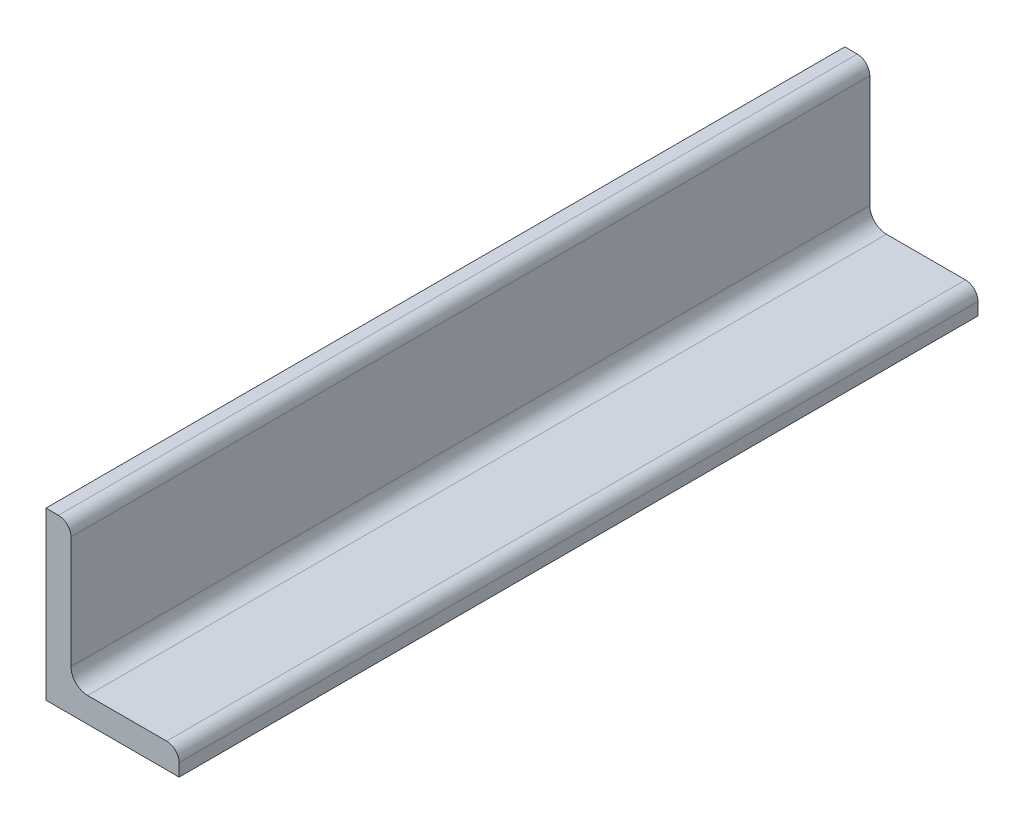
ISO-10303-21;
HEADER;
FILE_DESCRIPTION(('STEP AP214'),'2;1');
FILE_NAME('part.step','',(''),(''),'','','');
FILE_SCHEMA(('AUTOMOTIVE_DESIGN { 1 0 10303 214 1 1 1 1 }'));
ENDSEC;
DATA;
#1=APPLICATION_CONTEXT('core data for automotive mechanical design processes');
#2=APPLICATION_PROTOCOL_DEFINITION('international standard','automotive_design',2000,#1);
#3=PRODUCT_CONTEXT('',#1,'mechanical');
#4=PRODUCT('Part','Part','',(#3));
#5=PRODUCT_RELATED_PRODUCT_CATEGORY('part','',(#4));
#6=PRODUCT_DEFINITION_FORMATION('','',#4);
#7=PRODUCT_DEFINITION_CONTEXT('part definition',#1,'design');
#8=PRODUCT_DEFINITION('design','',#6,#7);
#9=PRODUCT_DEFINITION_SHAPE('','',#8);
#10=(LENGTH_UNIT() NAMED_UNIT(*) SI_UNIT(.MILLI.,.METRE.));
#11=(NAMED_UNIT(*) PLANE_ANGLE_UNIT() SI_UNIT($,.RADIAN.));
#12=(NAMED_UNIT(*) SI_UNIT($,.STERADIAN.) SOLID_ANGLE_UNIT());
#13=UNCERTAINTY_MEASURE_WITH_UNIT(LENGTH_MEASURE(1.E-05),#10,'distance_accuracy_value','');
#14=(GEOMETRIC_REPRESENTATION_CONTEXT(3) GLOBAL_UNCERTAINTY_ASSIGNED_CONTEXT((#13)) GLOBAL_UNIT_ASSIGNED_CONTEXT((#10,
#11,#12)) REPRESENTATION_CONTEXT('',''));
#15=CARTESIAN_POINT('',(0.,0.,0.));
#16=DIRECTION('',(0.,0.,1.));
#17=DIRECTION('',(1.,0.,0.));
#18=AXIS2_PLACEMENT_3D('',#15,#16,#17);
#19=CARTESIAN_POINT('',(0.116507760447575,63.8534276781816,304.8));
#20=DIRECTION('',(1.,0.,0.));
#21=DIRECTION('',(0.,0.,-1.));
#22=AXIS2_PLACEMENT_3D('',#19,#20,#21);
#23=PLANE('',#22);
#24=DIRECTION('',(0.,-1.,0.));
#25=VECTOR('',#24,1.);
#26=CARTESIAN_POINT('',(0.116507760447575,63.8534276781816,0.));
#27=LINE('',#26,#25);
#28=CARTESIAN_POINT('',(0.116507760447575,63.8534276781816,0.));
#29=VERTEX_POINT('',#28);
#30=CARTESIAN_POINT('',(0.116507760447575,0.353427678181561,0.));
#31=VERTEX_POINT('',#30);
#32=EDGE_CURVE('E135',#29,#31,#27,.T.);
#33=ORIENTED_EDGE('',*,*,#32,.T.);
#34=DIRECTION('',(0.,0.,-1.));
#35=VECTOR('',#34,1.);
#36=CARTESIAN_POINT('',(0.116507760447575,0.353427678181561,304.8));
#37=LINE('',#36,#35);
#38=CARTESIAN_POINT('',(0.116507760447575,0.353427678181561,304.8));
#39=VERTEX_POINT('',#38);
#40=EDGE_CURVE('E11',#39,#31,#37,.T.);
#41=ORIENTED_EDGE('',*,*,#40,.F.);
#42=DIRECTION('',(0.,-1.,0.));
#43=VECTOR('',#42,1.);
#44=CARTESIAN_POINT('',(0.116507760447575,63.8534276781816,304.8));
#45=LINE('',#44,#43);
#46=CARTESIAN_POINT('',(0.116507760447575,63.8534276781816,304.8));
#47=VERTEX_POINT('',#46);
#48=EDGE_CURVE('E151',#47,#39,#45,.T.);
#49=ORIENTED_EDGE('',*,*,#48,.F.);
#50=DIRECTION('',(0.,0.,-1.));
#51=VECTOR('',#50,1.);
#52=CARTESIAN_POINT('',(0.116507760447575,63.8534276781816,304.8));
#53=LINE('',#52,#51);
#54=EDGE_CURVE('E131',#47,#29,#53,.T.);
#55=ORIENTED_EDGE('',*,*,#54,.T.);
#56=EDGE_LOOP('',(#33,#41,#49,#55));
#57=FACE_BOUND('',#56,.T.);
#58=ADVANCED_FACE('F33',(#57),#23,.F.);
#59=CARTESIAN_POINT('',(0.116507760447575,0.353427678181561,304.8));
#60=DIRECTION('',(0.,1.,0.));
#61=DIRECTION('',(0.,0.,1.));
#62=AXIS2_PLACEMENT_3D('',#59,#60,#61);
#63=PLANE('',#62);
#64=DIRECTION('',(1.,0.,0.));
#65=VECTOR('',#64,1.);
#66=CARTESIAN_POINT('',(0.116507760447575,0.353427678181561,0.));
#67=LINE('',#66,#65);
#68=CARTESIAN_POINT('',(50.9165077604476,0.353427678181561,0.));
#69=VERTEX_POINT('',#68);
#70=EDGE_CURVE('E138',#31,#69,#67,.T.);
#71=ORIENTED_EDGE('',*,*,#70,.T.);
#72=DIRECTION('',(0.,0.,-1.));
#73=VECTOR('',#72,1.);
#74=CARTESIAN_POINT('',(50.9165077604476,0.353427678181561,304.8));
#75=LINE('',#74,#73);
#76=CARTESIAN_POINT('',(50.9165077604476,0.353427678181561,304.8));
#77=VERTEX_POINT('',#76);
#78=EDGE_CURVE('E41',#77,#69,#75,.T.);
#79=ORIENTED_EDGE('',*,*,#78,.F.);
#80=DIRECTION('',(1.,0.,0.));
#81=VECTOR('',#80,1.);
#82=CARTESIAN_POINT('',(0.116507760447575,0.353427678181561,304.8));
#83=LINE('',#82,#81);
#84=EDGE_CURVE('E95',#39,#77,#83,.T.);
#85=ORIENTED_EDGE('',*,*,#84,.F.);
#86=ORIENTED_EDGE('',*,*,#40,.T.);
#87=EDGE_LOOP('',(#71,#79,#85,#86));
#88=FACE_BOUND('',#87,.T.);
#89=ADVANCED_FACE('F194',(#88),#63,.F.);
#90=CARTESIAN_POINT('',(50.9165077604476,0.353427678181561,304.8));
#91=DIRECTION('',(-1.,0.,0.));
#92=DIRECTION('',(0.,0.,1.));
#93=AXIS2_PLACEMENT_3D('',#90,#91,#92);
#94=PLANE('',#93);
#95=DIRECTION('',(0.,1.,0.));
#96=VECTOR('',#95,1.);
#97=CARTESIAN_POINT('',(50.9165077604476,0.353427678181561,0.));
#98=LINE('',#97,#96);
#99=CARTESIAN_POINT('',(50.9165077604476,5.11592767818156,0.));
#100=VERTEX_POINT('',#99);
#101=EDGE_CURVE('E140',#69,#100,#98,.T.);
#102=ORIENTED_EDGE('',*,*,#101,.T.);
#103=DIRECTION('',(0.,0.,-1.));
#104=VECTOR('',#103,1.);
#105=CARTESIAN_POINT('',(50.9165077604476,5.11592767818156,304.8));
#106=LINE('',#105,#104);
#107=CARTESIAN_POINT('',(50.9165077604476,5.11592767818156,304.8));
#108=VERTEX_POINT('',#107);
#109=EDGE_CURVE('E161',#108,#100,#106,.T.);
#110=ORIENTED_EDGE('',*,*,#109,.F.);
#111=DIRECTION('',(0.,1.,0.));
#112=VECTOR('',#111,1.);
#113=CARTESIAN_POINT('',(50.9165077604476,0.353427678181561,304.8));
#114=LINE('',#113,#112);
#115=EDGE_CURVE('E169',#77,#108,#114,.T.);
#116=ORIENTED_EDGE('',*,*,#115,.F.);
#117=ORIENTED_EDGE('',*,*,#78,.T.);
#118=EDGE_LOOP('',(#102,#110,#116,#117));
#119=FACE_BOUND('',#118,.T.);
#120=ADVANCED_FACE('F167',(#119),#94,.F.);
#121=CARTESIAN_POINT('',(46.1540077604476,5.11592767818156,304.8));
#122=DIRECTION('',(0.,0.,-1.));
#123=DIRECTION('',(-1.,0.,0.));
#124=AXIS2_PLACEMENT_3D('',#121,#122,#123);
#125=CYLINDRICAL_SURFACE('',#124,4.7625);
#126=CARTESIAN_POINT('',(46.1540077604476,5.11592767818156,0.));
#127=DIRECTION('',(0.,0.,1.));
#128=DIRECTION('',(1.,0.,0.));
#129=AXIS2_PLACEMENT_3D('',#126,#127,#128);
#130=CIRCLE('',#129,4.7625);
#131=CARTESIAN_POINT('',(46.1540077604476,9.87842767818156,0.));
#132=VERTEX_POINT('',#131);
#133=EDGE_CURVE('E142',#100,#132,#130,.T.);
#134=ORIENTED_EDGE('',*,*,#133,.T.);
#135=DIRECTION('',(0.,0.,-1.));
#136=VECTOR('',#135,1.);
#137=CARTESIAN_POINT('',(46.1540077604476,9.87842767818156,304.8));
#138=LINE('',#137,#136);
#139=CARTESIAN_POINT('',(46.1540077604476,9.87842767818156,304.8));
#140=VERTEX_POINT('',#139);
#141=EDGE_CURVE('E158',#140,#132,#138,.T.);
#142=ORIENTED_EDGE('',*,*,#141,.F.);
#143=CARTESIAN_POINT('',(46.1540077604476,5.11592767818156,304.8));
#144=DIRECTION('',(0.,0.,1.));
#145=DIRECTION('',(1.,0.,0.));
#146=AXIS2_PLACEMENT_3D('',#143,#144,#145);
#147=CIRCLE('',#146,4.7625);
#148=EDGE_CURVE('E185',#108,#140,#147,.T.);
#149=ORIENTED_EDGE('',*,*,#148,.F.);
#150=ORIENTED_EDGE('',*,*,#109,.T.);
#151=EDGE_LOOP('',(#134,#142,#149,#150));
#152=FACE_BOUND('',#151,.T.);
#153=ADVANCED_FACE('F178',(#152),#125,.T.);
#154=CARTESIAN_POINT('',(46.1540077604476,9.87842767818156,304.8));
#155=DIRECTION('',(0.,-1.,0.));
#156=DIRECTION('',(0.,0.,-1.));
#157=AXIS2_PLACEMENT_3D('',#154,#155,#156);
#158=PLANE('',#157);
#159=DIRECTION('',(-1.,0.,0.));
#160=VECTOR('',#159,1.);
#161=CARTESIAN_POINT('',(46.1540077604476,9.87842767818156,0.));
#162=LINE('',#161,#160);
#163=CARTESIAN_POINT('',(15.9915077604476,9.87842767818156,0.));
#164=VERTEX_POINT('',#163);
#165=EDGE_CURVE('E144',#132,#164,#162,.T.);
#166=ORIENTED_EDGE('',*,*,#165,.T.);
#167=DIRECTION('',(0.,0.,-1.));
#168=VECTOR('',#167,1.);
#169=CARTESIAN_POINT('',(15.9915077604476,9.87842767818156,304.8));
#170=LINE('',#169,#168);
#171=CARTESIAN_POINT('',(15.9915077604476,9.87842767818156,304.8));
#172=VERTEX_POINT('',#171);
#173=EDGE_CURVE('E155',#172,#164,#170,.T.);
#174=ORIENTED_EDGE('',*,*,#173,.F.);
#175=DIRECTION('',(-1.,0.,0.));
#176=VECTOR('',#175,1.);
#177=CARTESIAN_POINT('',(46.1540077604476,9.87842767818156,304.8));
#178=LINE('',#177,#176);
#179=EDGE_CURVE('E184',#140,#172,#178,.T.);
#180=ORIENTED_EDGE('',*,*,#179,.F.);
#181=ORIENTED_EDGE('',*,*,#141,.T.);
#182=EDGE_LOOP('',(#166,#174,#180,#181));
#183=FACE_BOUND('',#182,.T.);
#184=ADVANCED_FACE('F182',(#183),#158,.F.);
#185=CARTESIAN_POINT('',(15.9915077604476,16.2284276781816,304.8));
#186=DIRECTION('',(0.,0.,-1.));
#187=DIRECTION('',(-1.,0.,0.));
#188=AXIS2_PLACEMENT_3D('',#185,#186,#187);
#189=CYLINDRICAL_SURFACE('',#188,6.34999999999999);
#190=CARTESIAN_POINT('',(15.9915077604476,16.2284276781816,0.));
#191=DIRECTION('',(0.,0.,-1.));
#192=DIRECTION('',(1.,0.,0.));
#193=AXIS2_PLACEMENT_3D('',#190,#191,#192);
#194=CIRCLE('',#193,6.34999999999999);
#195=CARTESIAN_POINT('',(9.64150776044758,16.2284276781816,0.));
#196=VERTEX_POINT('',#195);
#197=EDGE_CURVE('E146',#164,#196,#194,.T.);
#198=ORIENTED_EDGE('',*,*,#197,.T.);
#199=DIRECTION('',(0.,0.,-1.));
#200=VECTOR('',#199,1.);
#201=CARTESIAN_POINT('',(9.64150776044758,16.2284276781816,304.8));
#202=LINE('',#201,#200);
#203=CARTESIAN_POINT('',(9.64150776044758,16.2284276781816,304.8));
#204=VERTEX_POINT('',#203);
#205=EDGE_CURVE('E126',#204,#196,#202,.T.);
#206=ORIENTED_EDGE('',*,*,#205,.F.);
#207=CARTESIAN_POINT('',(15.9915077604476,16.2284276781816,304.8));
#208=DIRECTION('',(0.,0.,-1.));
#209=DIRECTION('',(1.,0.,0.));
#210=AXIS2_PLACEMENT_3D('',#207,#208,#209);
#211=CIRCLE('',#210,6.34999999999999);
#212=EDGE_CURVE('E117',#172,#204,#211,.T.);
#213=ORIENTED_EDGE('',*,*,#212,.F.);
#214=ORIENTED_EDGE('',*,*,#173,.T.);
#215=EDGE_LOOP('',(#198,#206,#213,#214));
#216=FACE_BOUND('',#215,.T.);
#217=ADVANCED_FACE('F206',(#216),#189,.F.);
#218=CARTESIAN_POINT('',(9.64150776044758,16.2284276781816,304.8));
#219=DIRECTION('',(-1.,0.,0.));
#220=DIRECTION('',(0.,0.,1.));
#221=AXIS2_PLACEMENT_3D('',#218,#219,#220);
#222=PLANE('',#221);
#223=DIRECTION('',(0.,1.,0.));
#224=VECTOR('',#223,1.);
#225=CARTESIAN_POINT('',(9.64150776044758,16.2284276781816,0.));
#226=LINE('',#225,#224);
#227=CARTESIAN_POINT('',(9.64150776044758,59.0909276781816,0.));
#228=VERTEX_POINT('',#227);
#229=EDGE_CURVE('E125',#196,#228,#226,.T.);
#230=ORIENTED_EDGE('',*,*,#229,.T.);
#231=DIRECTION('',(0.,0.,-1.));
#232=VECTOR('',#231,1.);
#233=CARTESIAN_POINT('',(9.64150776044758,59.0909276781816,304.8));
#234=LINE('',#233,#232);
#235=CARTESIAN_POINT('',(9.64150776044758,59.0909276781816,304.8));
#236=VERTEX_POINT('',#235);
#237=EDGE_CURVE('E122',#236,#228,#234,.T.);
#238=ORIENTED_EDGE('',*,*,#237,.F.);
#239=DIRECTION('',(0.,1.,0.));
#240=VECTOR('',#239,1.);
#241=CARTESIAN_POINT('',(9.64150776044758,16.2284276781816,304.8));
#242=LINE('',#241,#240);
#243=EDGE_CURVE('E111',#204,#236,#242,.T.);
#244=ORIENTED_EDGE('',*,*,#243,.F.);
#245=ORIENTED_EDGE('',*,*,#205,.T.);
#246=EDGE_LOOP('',(#230,#238,#244,#245));
#247=FACE_BOUND('',#246,.T.);
#248=ADVANCED_FACE('F123',(#247),#222,.F.);
#249=CARTESIAN_POINT('',(4.87900776044757,59.0909276781816,304.8));
#250=DIRECTION('',(0.,0.,-1.));
#251=DIRECTION('',(-1.,0.,0.));
#252=AXIS2_PLACEMENT_3D('',#249,#250,#251);
#253=CYLINDRICAL_SURFACE('',#252,4.7625);
#254=CARTESIAN_POINT('',(4.87900776044757,59.0909276781816,0.));
#255=DIRECTION('',(0.,0.,1.));
#256=DIRECTION('',(1.,0.,0.));
#257=AXIS2_PLACEMENT_3D('',#254,#255,#256);
#258=CIRCLE('',#257,4.7625);
#259=CARTESIAN_POINT('',(4.87900776044758,63.8534276781816,0.));
#260=VERTEX_POINT('',#259);
#261=EDGE_CURVE('E81',#228,#260,#258,.T.);
#262=ORIENTED_EDGE('',*,*,#261,.T.);
#263=DIRECTION('',(0.,0.,-1.));
#264=VECTOR('',#263,1.);
#265=CARTESIAN_POINT('',(4.87900776044758,63.8534276781816,304.8));
#266=LINE('',#265,#264);
#267=CARTESIAN_POINT('',(4.87900776044758,63.8534276781816,304.8));
#268=VERTEX_POINT('',#267);
#269=EDGE_CURVE('E127',#268,#260,#266,.T.);
#270=ORIENTED_EDGE('',*,*,#269,.F.);
#271=CARTESIAN_POINT('',(4.87900776044757,59.0909276781816,304.8));
#272=DIRECTION('',(0.,0.,1.));
#273=DIRECTION('',(1.,0.,0.));
#274=AXIS2_PLACEMENT_3D('',#271,#272,#273);
#275=CIRCLE('',#274,4.7625);
#276=EDGE_CURVE('E115',#236,#268,#275,.T.);
#277=ORIENTED_EDGE('',*,*,#276,.F.);
#278=ORIENTED_EDGE('',*,*,#237,.T.);
#279=EDGE_LOOP('',(#262,#270,#277,#278));
#280=FACE_BOUND('',#279,.T.);
#281=ADVANCED_FACE('F129',(#280),#253,.T.);
#282=CARTESIAN_POINT('',(4.87900776044758,63.8534276781816,304.8));
#283=DIRECTION('',(0.,-1.,0.));
#284=DIRECTION('',(0.,0.,-1.));
#285=AXIS2_PLACEMENT_3D('',#282,#283,#284);
#286=PLANE('',#285);
#287=DIRECTION('',(-1.,0.,0.));
#288=VECTOR('',#287,1.);
#289=CARTESIAN_POINT('',(4.87900776044758,63.8534276781816,0.));
#290=LINE('',#289,#288);
#291=EDGE_CURVE('E87',#260,#29,#290,.T.);
#292=ORIENTED_EDGE('',*,*,#291,.T.);
#293=ORIENTED_EDGE('',*,*,#54,.F.);
#294=DIRECTION('',(-1.,0.,0.));
#295=VECTOR('',#294,1.);
#296=CARTESIAN_POINT('',(4.87900776044758,63.8534276781816,304.8));
#297=LINE('',#296,#295);
#298=EDGE_CURVE('E49',#268,#47,#297,.T.);
#299=ORIENTED_EDGE('',*,*,#298,.F.);
#300=ORIENTED_EDGE('',*,*,#269,.T.);
#301=EDGE_LOOP('',(#292,#293,#299,#300));
#302=FACE_BOUND('',#301,.T.);
#303=ADVANCED_FACE('F214',(#302),#286,.F.);
#304=CARTESIAN_POINT('',(46.1540077604476,5.11592767818156,304.8));
#305=DIRECTION('',(0.,0.,1.));
#306=DIRECTION('',(1.,0.,0.));
#307=AXIS2_PLACEMENT_3D('',#304,#305,#306);
#308=PLANE('',#307);
#309=ORIENTED_EDGE('',*,*,#48,.T.);
#310=ORIENTED_EDGE('',*,*,#84,.T.);
#311=ORIENTED_EDGE('',*,*,#115,.T.);
#312=ORIENTED_EDGE('',*,*,#148,.T.);
#313=ORIENTED_EDGE('',*,*,#179,.T.);
#314=ORIENTED_EDGE('',*,*,#212,.T.);
#315=ORIENTED_EDGE('',*,*,#243,.T.);
#316=ORIENTED_EDGE('',*,*,#276,.T.);
#317=ORIENTED_EDGE('',*,*,#298,.T.);
#318=EDGE_LOOP('',(#309,#310,#311,#312,#313,#314,#315,#316,#317));
#319=FACE_BOUND('',#318,.T.);
#320=ADVANCED_FACE('F113',(#319),#308,.T.);
#321=CARTESIAN_POINT('',(46.1540077604476,5.11592767818156,0.));
#322=DIRECTION('',(0.,0.,1.));
#323=DIRECTION('',(1.,0.,0.));
#324=AXIS2_PLACEMENT_3D('',#321,#322,#323);
#325=PLANE('',#324);
#326=ORIENTED_EDGE('',*,*,#32,.F.);
#327=ORIENTED_EDGE('',*,*,#291,.F.);
#328=ORIENTED_EDGE('',*,*,#261,.F.);
#329=ORIENTED_EDGE('',*,*,#229,.F.);
#330=ORIENTED_EDGE('',*,*,#197,.F.);
#331=ORIENTED_EDGE('',*,*,#165,.F.);
#332=ORIENTED_EDGE('',*,*,#133,.F.);
#333=ORIENTED_EDGE('',*,*,#101,.F.);
#334=ORIENTED_EDGE('',*,*,#70,.F.);
#335=EDGE_LOOP('',(#326,#327,#328,#329,#330,#331,#332,#333,#334));
#336=FACE_BOUND('',#335,.T.);
#337=ADVANCED_FACE('F173',(#336),#325,.F.);
#338=CLOSED_SHELL('',(#58,#89,#120,#153,#184,#217,#248,#281,#303,#320,#337));
#339=MANIFOLD_SOLID_BREP('B2',#338);
#340=ADVANCED_BREP_SHAPE_REPRESENTATION('',(#18,#339),#14);
#341=SHAPE_DEFINITION_REPRESENTATION(#9,#340);
ENDSEC;
END-ISO-10303-21;
